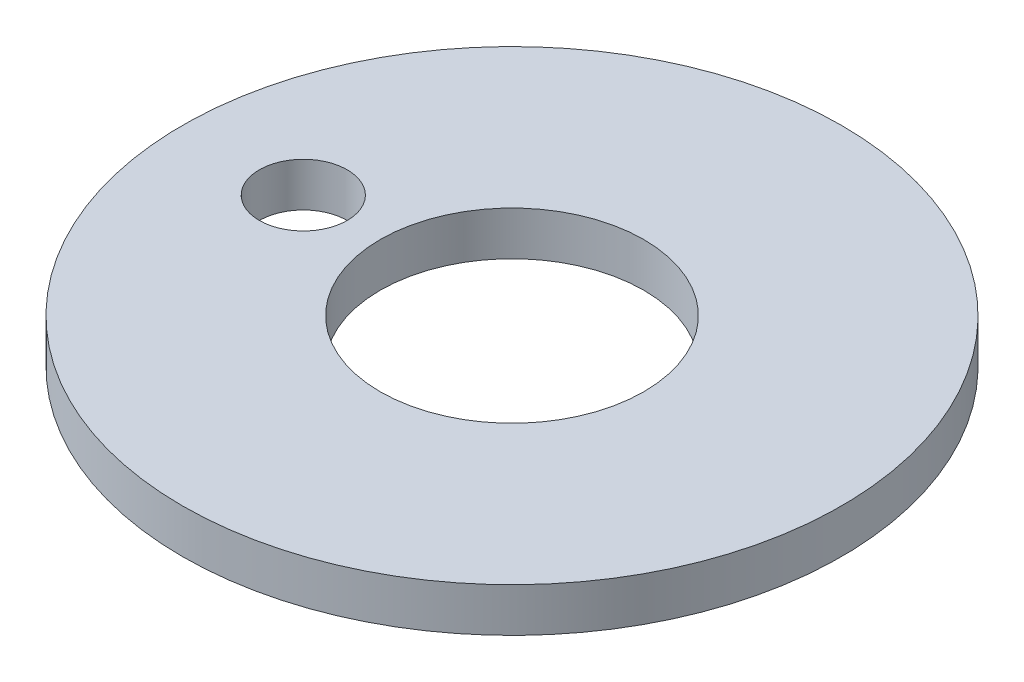
ISO-10303-21;
HEADER;
FILE_DESCRIPTION(('STEP AP214'),'2;1');
FILE_NAME('part.step','',(''),(''),'','','');
FILE_SCHEMA(('AUTOMOTIVE_DESIGN { 1 0 10303 214 1 1 1 1 }'));
ENDSEC;
DATA;
#1=APPLICATION_CONTEXT('core data for automotive mechanical design processes');
#2=APPLICATION_PROTOCOL_DEFINITION('international standard','automotive_design',2000,#1);
#3=PRODUCT_CONTEXT('',#1,'mechanical');
#4=PRODUCT('Part','Part','',(#3));
#5=PRODUCT_RELATED_PRODUCT_CATEGORY('part','',(#4));
#6=PRODUCT_DEFINITION_FORMATION('','',#4);
#7=PRODUCT_DEFINITION_CONTEXT('part definition',#1,'design');
#8=PRODUCT_DEFINITION('design','',#6,#7);
#9=PRODUCT_DEFINITION_SHAPE('','',#8);
#10=(LENGTH_UNIT() NAMED_UNIT(*) SI_UNIT(.MILLI.,.METRE.));
#11=(NAMED_UNIT(*) PLANE_ANGLE_UNIT() SI_UNIT($,.RADIAN.));
#12=(NAMED_UNIT(*) SI_UNIT($,.STERADIAN.) SOLID_ANGLE_UNIT());
#13=UNCERTAINTY_MEASURE_WITH_UNIT(LENGTH_MEASURE(1.E-05),#10,'distance_accuracy_value','');
#14=(GEOMETRIC_REPRESENTATION_CONTEXT(3) GLOBAL_UNCERTAINTY_ASSIGNED_CONTEXT((#13)) GLOBAL_UNIT_ASSIGNED_CONTEXT((#10,
#11,#12)) REPRESENTATION_CONTEXT('',''));
#15=CARTESIAN_POINT('',(0.,0.,0.));
#16=DIRECTION('',(0.,0.,1.));
#17=DIRECTION('',(1.,0.,0.));
#18=AXIS2_PLACEMENT_3D('',#15,#16,#17);
#19=CARTESIAN_POINT('',(0.,2.,0.));
#20=DIRECTION('',(0.,1.,0.));
#21=DIRECTION('',(0.,0.,1.));
#22=AXIS2_PLACEMENT_3D('',#19,#20,#21);
#23=PLANE('',#22);
#24=CARTESIAN_POINT('',(-9.5,2.,0.));
#25=DIRECTION('',(0.,1.,0.));
#26=DIRECTION('',(0.,0.,1.));
#27=AXIS2_PLACEMENT_3D('',#24,#25,#26);
#28=CIRCLE('',#27,2.);
#29=CARTESIAN_POINT('',(-9.5,2.,2.));
#30=VERTEX_POINT('',#29);
#31=EDGE_CURVE('E42',#30,#30,#28,.T.);
#32=ORIENTED_EDGE('',*,*,#31,.F.);
#33=EDGE_LOOP('',(#32));
#34=FACE_BOUND('',#33,.T.);
#35=CARTESIAN_POINT('',(0.,2.,0.));
#36=DIRECTION('',(0.,1.,0.));
#37=DIRECTION('',(0.,0.,1.));
#38=AXIS2_PLACEMENT_3D('',#35,#36,#37);
#39=CIRCLE('',#38,15.);
#40=CARTESIAN_POINT('',(0.,2.,15.));
#41=VERTEX_POINT('',#40);
#42=EDGE_CURVE('E10',#41,#41,#39,.T.);
#43=ORIENTED_EDGE('',*,*,#42,.T.);
#44=EDGE_LOOP('',(#43));
#45=FACE_BOUND('',#44,.T.);
#46=CARTESIAN_POINT('',(0.,2.,0.));
#47=DIRECTION('',(0.,1.,0.));
#48=DIRECTION('',(0.,0.,1.));
#49=AXIS2_PLACEMENT_3D('',#46,#47,#48);
#50=CIRCLE('',#49,6.);
#51=CARTESIAN_POINT('',(0.,2.,6.));
#52=VERTEX_POINT('',#51);
#53=EDGE_CURVE('E47',#52,#52,#50,.T.);
#54=ORIENTED_EDGE('',*,*,#53,.F.);
#55=EDGE_LOOP('',(#54));
#56=FACE_BOUND('',#55,.T.);
#57=ADVANCED_FACE('F31',(#34,#45,#56),#23,.T.);
#58=CARTESIAN_POINT('',(0.,0.,0.));
#59=DIRECTION('',(0.,1.,0.));
#60=DIRECTION('',(0.,0.,1.));
#61=AXIS2_PLACEMENT_3D('',#58,#59,#60);
#62=PLANE('',#61);
#63=CARTESIAN_POINT('',(-9.5,0.,0.));
#64=DIRECTION('',(0.,1.,0.));
#65=DIRECTION('',(0.,0.,1.));
#66=AXIS2_PLACEMENT_3D('',#63,#64,#65);
#67=CIRCLE('',#66,2.);
#68=CARTESIAN_POINT('',(-9.5,0.,2.));
#69=VERTEX_POINT('',#68);
#70=EDGE_CURVE('E44',#69,#69,#67,.T.);
#71=ORIENTED_EDGE('',*,*,#70,.T.);
#72=EDGE_LOOP('',(#71));
#73=FACE_BOUND('',#72,.T.);
#74=CARTESIAN_POINT('',(0.,0.,0.));
#75=DIRECTION('',(0.,1.,0.));
#76=DIRECTION('',(0.,0.,1.));
#77=AXIS2_PLACEMENT_3D('',#74,#75,#76);
#78=CIRCLE('',#77,15.);
#79=CARTESIAN_POINT('',(0.,0.,15.));
#80=VERTEX_POINT('',#79);
#81=EDGE_CURVE('E35',#80,#80,#78,.T.);
#82=ORIENTED_EDGE('',*,*,#81,.F.);
#83=EDGE_LOOP('',(#82));
#84=FACE_BOUND('',#83,.T.);
#85=CARTESIAN_POINT('',(0.,0.,0.));
#86=DIRECTION('',(0.,1.,0.));
#87=DIRECTION('',(0.,0.,1.));
#88=AXIS2_PLACEMENT_3D('',#85,#86,#87);
#89=CIRCLE('',#88,6.);
#90=CARTESIAN_POINT('',(0.,0.,6.));
#91=VERTEX_POINT('',#90);
#92=EDGE_CURVE('E50',#91,#91,#89,.T.);
#93=ORIENTED_EDGE('',*,*,#92,.T.);
#94=EDGE_LOOP('',(#93));
#95=FACE_BOUND('',#94,.T.);
#96=ADVANCED_FACE('F60',(#73,#84,#95),#62,.F.);
#97=CARTESIAN_POINT('',(0.,2.,0.));
#98=DIRECTION('',(0.,-1.,0.));
#99=DIRECTION('',(0.,0.,-1.));
#100=AXIS2_PLACEMENT_3D('',#97,#98,#99);
#101=CYLINDRICAL_SURFACE('',#100,15.);
#102=ORIENTED_EDGE('',*,*,#42,.F.);
#103=EDGE_LOOP('',(#102));
#104=FACE_BOUND('',#103,.T.);
#105=ORIENTED_EDGE('',*,*,#81,.T.);
#106=EDGE_LOOP('',(#105));
#107=FACE_BOUND('',#106,.T.);
#108=ADVANCED_FACE('F33',(#104,#107),#101,.T.);
#109=CARTESIAN_POINT('',(-9.5,2.,0.));
#110=DIRECTION('',(0.,-1.,0.));
#111=DIRECTION('',(0.,0.,-1.));
#112=AXIS2_PLACEMENT_3D('',#109,#110,#111);
#113=CYLINDRICAL_SURFACE('',#112,2.);
#114=ORIENTED_EDGE('',*,*,#31,.T.);
#115=EDGE_LOOP('',(#114));
#116=FACE_BOUND('',#115,.T.);
#117=ORIENTED_EDGE('',*,*,#70,.F.);
#118=EDGE_LOOP('',(#117));
#119=FACE_BOUND('',#118,.T.);
#120=ADVANCED_FACE('F69',(#116,#119),#113,.F.);
#121=CARTESIAN_POINT('',(0.,2.,0.));
#122=DIRECTION('',(0.,-1.,0.));
#123=DIRECTION('',(0.,0.,-1.));
#124=AXIS2_PLACEMENT_3D('',#121,#122,#123);
#125=CYLINDRICAL_SURFACE('',#124,6.);
#126=ORIENTED_EDGE('',*,*,#53,.T.);
#127=EDGE_LOOP('',(#126));
#128=FACE_BOUND('',#127,.T.);
#129=ORIENTED_EDGE('',*,*,#92,.F.);
#130=EDGE_LOOP('',(#129));
#131=FACE_BOUND('',#130,.T.);
#132=ADVANCED_FACE('F56',(#128,#131),#125,.F.);
#133=CLOSED_SHELL('',(#57,#96,#108,#120,#132));
#134=MANIFOLD_SOLID_BREP('B2',#133);
#135=ADVANCED_BREP_SHAPE_REPRESENTATION('',(#18,#134),#14);
#136=SHAPE_DEFINITION_REPRESENTATION(#9,#135);
ENDSEC;
END-ISO-10303-21;
